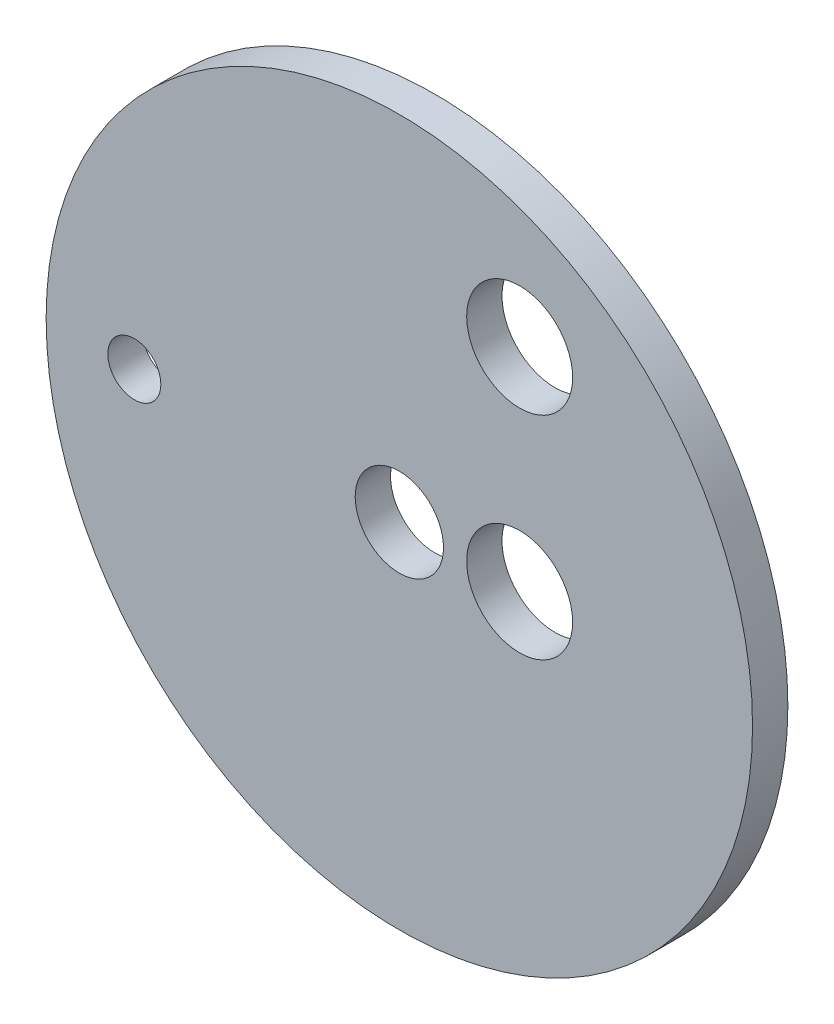
ISO-10303-21;
HEADER;
FILE_DESCRIPTION(('STEP AP214'),'2;1');
FILE_NAME('part.step','',(''),(''),'','','');
FILE_SCHEMA(('AUTOMOTIVE_DESIGN { 1 0 10303 214 1 1 1 1 }'));
ENDSEC;
DATA;
#1=APPLICATION_CONTEXT('core data for automotive mechanical design processes');
#2=APPLICATION_PROTOCOL_DEFINITION('international standard','automotive_design',2000,#1);
#3=PRODUCT_CONTEXT('',#1,'mechanical');
#4=PRODUCT('Part','Part','',(#3));
#5=PRODUCT_RELATED_PRODUCT_CATEGORY('part','',(#4));
#6=PRODUCT_DEFINITION_FORMATION('','',#4);
#7=PRODUCT_DEFINITION_CONTEXT('part definition',#1,'design');
#8=PRODUCT_DEFINITION('design','',#6,#7);
#9=PRODUCT_DEFINITION_SHAPE('','',#8);
#10=(LENGTH_UNIT() NAMED_UNIT(*) SI_UNIT(.MILLI.,.METRE.));
#11=(NAMED_UNIT(*) PLANE_ANGLE_UNIT() SI_UNIT($,.RADIAN.));
#12=(NAMED_UNIT(*) SI_UNIT($,.STERADIAN.) SOLID_ANGLE_UNIT());
#13=UNCERTAINTY_MEASURE_WITH_UNIT(LENGTH_MEASURE(1.E-05),#10,'distance_accuracy_value','');
#14=(GEOMETRIC_REPRESENTATION_CONTEXT(3) GLOBAL_UNCERTAINTY_ASSIGNED_CONTEXT((#13)) GLOBAL_UNIT_ASSIGNED_CONTEXT((#10,
#11,#12)) REPRESENTATION_CONTEXT('',''));
#15=CARTESIAN_POINT('',(0.,0.,0.));
#16=DIRECTION('',(0.,0.,1.));
#17=DIRECTION('',(1.,0.,0.));
#18=AXIS2_PLACEMENT_3D('',#15,#16,#17);
#19=CARTESIAN_POINT('',(0.,0.,10.));
#20=DIRECTION('',(0.,0.,-1.));
#21=DIRECTION('',(-1.,0.,0.));
#22=AXIS2_PLACEMENT_3D('',#19,#20,#21);
#23=CYLINDRICAL_SURFACE('',#22,100.);
#24=CARTESIAN_POINT('',(0.,0.,10.));
#25=DIRECTION('',(0.,0.,1.));
#26=DIRECTION('',(1.,0.,0.));
#27=AXIS2_PLACEMENT_3D('',#24,#25,#26);
#28=CIRCLE('',#27,100.);
#29=CARTESIAN_POINT('',(100.,0.,10.));
#30=VERTEX_POINT('',#29);
#31=EDGE_CURVE('E10',#30,#30,#28,.T.);
#32=ORIENTED_EDGE('',*,*,#31,.F.);
#33=EDGE_LOOP('',(#32));
#34=FACE_BOUND('',#33,.T.);
#35=CARTESIAN_POINT('',(0.,0.,0.));
#36=DIRECTION('',(0.,0.,1.));
#37=DIRECTION('',(1.,0.,0.));
#38=AXIS2_PLACEMENT_3D('',#35,#36,#37);
#39=CIRCLE('',#38,100.);
#40=CARTESIAN_POINT('',(100.,0.,0.));
#41=VERTEX_POINT('',#40);
#42=EDGE_CURVE('E40',#41,#41,#39,.T.);
#43=ORIENTED_EDGE('',*,*,#42,.T.);
#44=EDGE_LOOP('',(#43));
#45=FACE_BOUND('',#44,.T.);
#46=ADVANCED_FACE('F37',(#34,#45),#23,.T.);
#47=CARTESIAN_POINT('',(0.,0.,10.));
#48=DIRECTION('',(0.,0.,1.));
#49=DIRECTION('',(1.,0.,0.));
#50=AXIS2_PLACEMENT_3D('',#47,#48,#49);
#51=PLANE('',#50);
#52=CARTESIAN_POINT('',(34.0613521590427,60.,10.));
#53=DIRECTION('',(0.,0.,1.));
#54=DIRECTION('',(1.,0.,0.));
#55=AXIS2_PLACEMENT_3D('',#52,#53,#54);
#56=CIRCLE('',#55,15.);
#57=CARTESIAN_POINT('',(49.0613521590427,60.,10.));
#58=VERTEX_POINT('',#57);
#59=EDGE_CURVE('E71',#58,#58,#56,.T.);
#60=ORIENTED_EDGE('',*,*,#59,.F.);
#61=EDGE_LOOP('',(#60));
#62=FACE_BOUND('',#61,.T.);
#63=CARTESIAN_POINT('',(34.0613521590427,0.,10.));
#64=DIRECTION('',(0.,0.,1.));
#65=DIRECTION('',(1.,0.,0.));
#66=AXIS2_PLACEMENT_3D('',#63,#64,#65);
#67=CIRCLE('',#66,15.);
#68=CARTESIAN_POINT('',(49.0613521590427,0.,10.));
#69=VERTEX_POINT('',#68);
#70=EDGE_CURVE('E67',#69,#69,#67,.T.);
#71=ORIENTED_EDGE('',*,*,#70,.F.);
#72=EDGE_LOOP('',(#71));
#73=FACE_BOUND('',#72,.T.);
#74=CARTESIAN_POINT('',(-75.0277551705241,0.,10.));
#75=DIRECTION('',(0.,0.,1.));
#76=DIRECTION('',(1.,0.,0.));
#77=AXIS2_PLACEMENT_3D('',#74,#75,#76);
#78=CIRCLE('',#77,7.50000000000001);
#79=CARTESIAN_POINT('',(-67.5277551705241,0.,10.));
#80=VERTEX_POINT('',#79);
#81=EDGE_CURVE('E59',#80,#80,#78,.T.);
#82=ORIENTED_EDGE('',*,*,#81,.F.);
#83=EDGE_LOOP('',(#82));
#84=FACE_BOUND('',#83,.T.);
#85=CARTESIAN_POINT('',(0.,0.,10.));
#86=DIRECTION('',(0.,0.,1.));
#87=DIRECTION('',(1.,0.,0.));
#88=AXIS2_PLACEMENT_3D('',#85,#86,#87);
#89=CIRCLE('',#88,12.5);
#90=CARTESIAN_POINT('',(12.5,0.,10.));
#91=VERTEX_POINT('',#90);
#92=EDGE_CURVE('E49',#91,#91,#89,.T.);
#93=ORIENTED_EDGE('',*,*,#92,.F.);
#94=EDGE_LOOP('',(#93));
#95=FACE_BOUND('',#94,.T.);
#96=ORIENTED_EDGE('',*,*,#31,.T.);
#97=EDGE_LOOP('',(#96));
#98=FACE_BOUND('',#97,.T.);
#99=ADVANCED_FACE('F89',(#62,#73,#84,#95,#98),#51,.T.);
#100=CARTESIAN_POINT('',(0.,0.,0.));
#101=DIRECTION('',(0.,0.,1.));
#102=DIRECTION('',(1.,0.,0.));
#103=AXIS2_PLACEMENT_3D('',#100,#101,#102);
#104=PLANE('',#103);
#105=CARTESIAN_POINT('',(34.0613521590427,60.,0.));
#106=DIRECTION('',(0.,0.,-1.));
#107=DIRECTION('',(-1.,0.,0.));
#108=AXIS2_PLACEMENT_3D('',#105,#106,#107);
#109=CIRCLE('',#108,15.);
#110=CARTESIAN_POINT('',(19.0613521590427,60.,0.));
#111=VERTEX_POINT('',#110);
#112=EDGE_CURVE('E78',#111,#111,#109,.T.);
#113=ORIENTED_EDGE('',*,*,#112,.F.);
#114=EDGE_LOOP('',(#113));
#115=FACE_BOUND('',#114,.T.);
#116=CARTESIAN_POINT('',(34.0613521590427,0.,0.));
#117=DIRECTION('',(0.,0.,1.));
#118=DIRECTION('',(1.,0.,0.));
#119=AXIS2_PLACEMENT_3D('',#116,#117,#118);
#120=CIRCLE('',#119,15.);
#121=CARTESIAN_POINT('',(49.0613521590427,0.,0.));
#122=VERTEX_POINT('',#121);
#123=EDGE_CURVE('E63',#122,#122,#120,.T.);
#124=ORIENTED_EDGE('',*,*,#123,.T.);
#125=EDGE_LOOP('',(#124));
#126=FACE_BOUND('',#125,.T.);
#127=CARTESIAN_POINT('',(-75.0277551705241,0.,0.));
#128=DIRECTION('',(0.,0.,1.));
#129=DIRECTION('',(1.,0.,0.));
#130=AXIS2_PLACEMENT_3D('',#127,#128,#129);
#131=CIRCLE('',#130,7.50000000000001);
#132=CARTESIAN_POINT('',(-67.5277551705241,0.,0.));
#133=VERTEX_POINT('',#132);
#134=EDGE_CURVE('E58',#133,#133,#131,.T.);
#135=ORIENTED_EDGE('',*,*,#134,.T.);
#136=EDGE_LOOP('',(#135));
#137=FACE_BOUND('',#136,.T.);
#138=CARTESIAN_POINT('',(0.,0.,0.));
#139=DIRECTION('',(0.,0.,-1.));
#140=DIRECTION('',(-1.,0.,0.));
#141=AXIS2_PLACEMENT_3D('',#138,#139,#140);
#142=CIRCLE('',#141,12.5);
#143=CARTESIAN_POINT('',(-12.5,0.,0.));
#144=VERTEX_POINT('',#143);
#145=EDGE_CURVE('E54',#144,#144,#142,.T.);
#146=ORIENTED_EDGE('',*,*,#145,.F.);
#147=EDGE_LOOP('',(#146));
#148=FACE_BOUND('',#147,.T.);
#149=ORIENTED_EDGE('',*,*,#42,.F.);
#150=EDGE_LOOP('',(#149));
#151=FACE_BOUND('',#150,.T.);
#152=ADVANCED_FACE('F85',(#115,#126,#137,#148,#151),#104,.F.);
#153=CARTESIAN_POINT('',(0.,0.,20.));
#154=DIRECTION('',(0.,0.,-1.));
#155=DIRECTION('',(-1.,0.,0.));
#156=AXIS2_PLACEMENT_3D('',#153,#154,#155);
#157=CYLINDRICAL_SURFACE('',#156,12.5);
#158=ORIENTED_EDGE('',*,*,#92,.T.);
#159=EDGE_LOOP('',(#158));
#160=FACE_BOUND('',#159,.T.);
#161=ORIENTED_EDGE('',*,*,#145,.T.);
#162=EDGE_LOOP('',(#161));
#163=FACE_BOUND('',#162,.T.);
#164=ADVANCED_FACE('F88',(#160,#163),#157,.F.);
#165=CARTESIAN_POINT('',(-75.0277551705241,0.,0.));
#166=DIRECTION('',(0.,0.,1.));
#167=DIRECTION('',(1.,0.,0.));
#168=AXIS2_PLACEMENT_3D('',#165,#166,#167);
#169=CYLINDRICAL_SURFACE('',#168,7.50000000000001);
#170=ORIENTED_EDGE('',*,*,#134,.F.);
#171=EDGE_LOOP('',(#170));
#172=FACE_BOUND('',#171,.T.);
#173=ORIENTED_EDGE('',*,*,#81,.T.);
#174=EDGE_LOOP('',(#173));
#175=FACE_BOUND('',#174,.T.);
#176=ADVANCED_FACE('F113',(#172,#175),#169,.F.);
#177=CARTESIAN_POINT('',(34.0613521590427,0.,0.));
#178=DIRECTION('',(0.,0.,1.));
#179=DIRECTION('',(1.,0.,0.));
#180=AXIS2_PLACEMENT_3D('',#177,#178,#179);
#181=CYLINDRICAL_SURFACE('',#180,15.);
#182=ORIENTED_EDGE('',*,*,#123,.F.);
#183=EDGE_LOOP('',(#182));
#184=FACE_BOUND('',#183,.T.);
#185=ORIENTED_EDGE('',*,*,#70,.T.);
#186=EDGE_LOOP('',(#185));
#187=FACE_BOUND('',#186,.T.);
#188=ADVANCED_FACE('F117',(#184,#187),#181,.F.);
#189=CARTESIAN_POINT('',(34.0613521590427,60.,30.));
#190=DIRECTION('',(0.,0.,-1.));
#191=DIRECTION('',(-1.,0.,0.));
#192=AXIS2_PLACEMENT_3D('',#189,#190,#191);
#193=CYLINDRICAL_SURFACE('',#192,15.);
#194=ORIENTED_EDGE('',*,*,#59,.T.);
#195=EDGE_LOOP('',(#194));
#196=FACE_BOUND('',#195,.T.);
#197=ORIENTED_EDGE('',*,*,#112,.T.);
#198=EDGE_LOOP('',(#197));
#199=FACE_BOUND('',#198,.T.);
#200=ADVANCED_FACE('F83',(#196,#199),#193,.F.);
#201=CLOSED_SHELL('',(#46,#99,#152,#164,#176,#188,#200));
#202=MANIFOLD_SOLID_BREP('B2',#201);
#203=ADVANCED_BREP_SHAPE_REPRESENTATION('',(#18,#202),#14);
#204=SHAPE_DEFINITION_REPRESENTATION(#9,#203);
ENDSEC;
END-ISO-10303-21;
